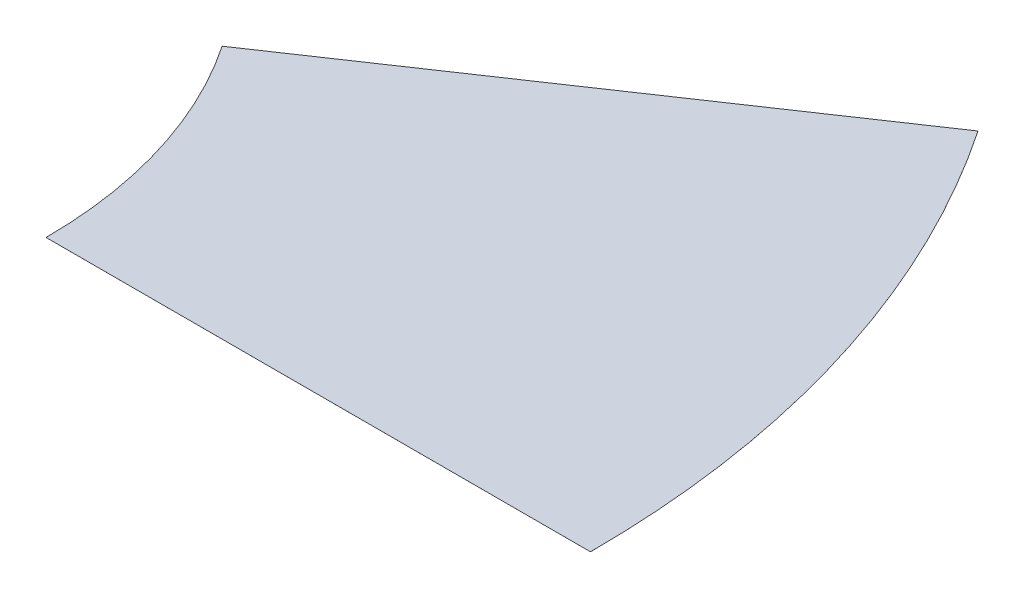
ISO-10303-21;
HEADER;
FILE_DESCRIPTION(('STEP AP214'),'2;1');
FILE_NAME('part.step','',(''),(''),'','','');
FILE_SCHEMA(('AUTOMOTIVE_DESIGN { 1 0 10303 214 1 1 1 1 }'));
ENDSEC;
DATA;
#1=APPLICATION_CONTEXT('core data for automotive mechanical design processes');
#2=APPLICATION_PROTOCOL_DEFINITION('international standard','automotive_design',2000,#1);
#3=PRODUCT_CONTEXT('',#1,'mechanical');
#4=PRODUCT('Part','Part','',(#3));
#5=PRODUCT_RELATED_PRODUCT_CATEGORY('part','',(#4));
#6=PRODUCT_DEFINITION_FORMATION('','',#4);
#7=PRODUCT_DEFINITION_CONTEXT('part definition',#1,'design');
#8=PRODUCT_DEFINITION('design','',#6,#7);
#9=PRODUCT_DEFINITION_SHAPE('','',#8);
#10=(LENGTH_UNIT() NAMED_UNIT(*) SI_UNIT(.MILLI.,.METRE.));
#11=(NAMED_UNIT(*) PLANE_ANGLE_UNIT() SI_UNIT($,.RADIAN.));
#12=(NAMED_UNIT(*) SI_UNIT($,.STERADIAN.) SOLID_ANGLE_UNIT());
#13=UNCERTAINTY_MEASURE_WITH_UNIT(LENGTH_MEASURE(1.E-05),#10,'distance_accuracy_value','');
#14=(GEOMETRIC_REPRESENTATION_CONTEXT(3) GLOBAL_UNCERTAINTY_ASSIGNED_CONTEXT((#13)) GLOBAL_UNIT_ASSIGNED_CONTEXT((#10,
#11,#12)) REPRESENTATION_CONTEXT('',''));
#15=CARTESIAN_POINT('',(0.,0.,0.));
#16=DIRECTION('',(0.,0.,1.));
#17=DIRECTION('',(1.,0.,0.));
#18=AXIS2_PLACEMENT_3D('',#15,#16,#17);
#19=CARTESIAN_POINT('',(0.,0.001,0.));
#20=DIRECTION('',(0.,-1.,0.));
#21=DIRECTION('',(0.,0.,-1.));
#22=AXIS2_PLACEMENT_3D('',#19,#20,#21);
#23=CYLINDRICAL_SURFACE('',#22,110.);
#24=CARTESIAN_POINT('',(0.,0.,0.));
#25=DIRECTION('',(0.,1.,0.));
#26=DIRECTION('',(0.,0.,1.));
#27=AXIS2_PLACEMENT_3D('',#24,#25,#26);
#28=CIRCLE('',#27,110.);
#29=CARTESIAN_POINT('',(110.,0.,0.));
#30=VERTEX_POINT('',#29);
#31=CARTESIAN_POINT('',(91.1941329810549,0.,-61.5112193817816));
#32=VERTEX_POINT('',#31);
#33=EDGE_CURVE('E97',#30,#32,#28,.T.);
#34=ORIENTED_EDGE('',*,*,#33,.T.);
#35=DIRECTION('',(0.,-1.,0.));
#36=VECTOR('',#35,1.);
#37=CARTESIAN_POINT('',(91.1941329810549,0.001,-61.5112193817816));
#38=LINE('',#37,#36);
#39=CARTESIAN_POINT('',(91.1941329810549,0.001,-61.5112193817816));
#40=VERTEX_POINT('',#39);
#41=EDGE_CURVE('E11',#40,#32,#38,.T.);
#42=ORIENTED_EDGE('',*,*,#41,.F.);
#43=CARTESIAN_POINT('',(0.,0.001,0.));
#44=DIRECTION('',(0.,1.,0.));
#45=DIRECTION('',(0.,0.,1.));
#46=AXIS2_PLACEMENT_3D('',#43,#44,#45);
#47=CIRCLE('',#46,110.);
#48=CARTESIAN_POINT('',(110.,0.001,0.));
#49=VERTEX_POINT('',#48);
#50=EDGE_CURVE('E83',#49,#40,#47,.T.);
#51=ORIENTED_EDGE('',*,*,#50,.F.);
#52=DIRECTION('',(0.,-1.,0.));
#53=VECTOR('',#52,1.);
#54=CARTESIAN_POINT('',(110.,0.001,0.));
#55=LINE('',#54,#53);
#56=EDGE_CURVE('E50',#49,#30,#55,.T.);
#57=ORIENTED_EDGE('',*,*,#56,.T.);
#58=EDGE_LOOP('',(#34,#42,#51,#57));
#59=FACE_BOUND('',#58,.T.);
#60=ADVANCED_FACE('F34',(#59),#23,.T.);
#61=CARTESIAN_POINT('',(91.1941329810549,0.001,-61.5112193817816));
#62=DIRECTION('',(0.559192903470742,0.,0.829037572555045));
#63=DIRECTION('',(0.829037572555045,0.,-0.559192903470742));
#64=AXIS2_PLACEMENT_3D('',#61,#62,#63);
#65=PLANE('',#64);
#66=DIRECTION('',(-0.829037572555045,0.,0.559192903470742));
#67=VECTOR('',#66,1.);
#68=CARTESIAN_POINT('',(91.1941329810549,0.,-61.5112193817816));
#69=LINE('',#68,#67);
#70=CARTESIAN_POINT('',(41.4518786277522,0.,-27.9596451735371));
#71=VERTEX_POINT('',#70);
#72=EDGE_CURVE('E88',#32,#71,#69,.T.);
#73=ORIENTED_EDGE('',*,*,#72,.T.);
#74=DIRECTION('',(0.,-1.,0.));
#75=VECTOR('',#74,1.);
#76=CARTESIAN_POINT('',(41.4518786277522,0.001,-27.9596451735371));
#77=LINE('',#76,#75);
#78=CARTESIAN_POINT('',(41.4518786277522,0.001,-27.9596451735371));
#79=VERTEX_POINT('',#78);
#80=EDGE_CURVE('E42',#79,#71,#77,.T.);
#81=ORIENTED_EDGE('',*,*,#80,.F.);
#82=DIRECTION('',(-0.829037572555045,0.,0.559192903470742));
#83=VECTOR('',#82,1.);
#84=CARTESIAN_POINT('',(91.1941329810549,0.001,-61.5112193817816));
#85=LINE('',#84,#83);
#86=EDGE_CURVE('E75',#40,#79,#85,.T.);
#87=ORIENTED_EDGE('',*,*,#86,.F.);
#88=ORIENTED_EDGE('',*,*,#41,.T.);
#89=EDGE_LOOP('',(#73,#81,#87,#88));
#90=FACE_BOUND('',#89,.T.);
#91=ADVANCED_FACE('F87',(#90),#65,.F.);
#92=CARTESIAN_POINT('',(0.,0.001,0.));
#93=DIRECTION('',(0.,-1.,0.));
#94=DIRECTION('',(0.,0.,-1.));
#95=AXIS2_PLACEMENT_3D('',#92,#93,#94);
#96=CYLINDRICAL_SURFACE('',#95,50.);
#97=CARTESIAN_POINT('',(0.,0.,0.));
#98=DIRECTION('',(0.,1.,0.));
#99=DIRECTION('',(0.,0.,1.));
#100=AXIS2_PLACEMENT_3D('',#97,#98,#99);
#101=CIRCLE('',#100,50.);
#102=CARTESIAN_POINT('',(50.,0.,0.));
#103=VERTEX_POINT('',#102);
#104=EDGE_CURVE('E100',#103,#71,#101,.T.);
#105=ORIENTED_EDGE('',*,*,#104,.F.);
#106=DIRECTION('',(0.,-1.,0.));
#107=VECTOR('',#106,1.);
#108=CARTESIAN_POINT('',(50.,0.001,0.));
#109=LINE('',#108,#107);
#110=CARTESIAN_POINT('',(50.,0.001,0.));
#111=VERTEX_POINT('',#110);
#112=EDGE_CURVE('E64',#111,#103,#109,.T.);
#113=ORIENTED_EDGE('',*,*,#112,.F.);
#114=CARTESIAN_POINT('',(0.,0.001,0.));
#115=DIRECTION('',(0.,1.,0.));
#116=DIRECTION('',(0.,0.,1.));
#117=AXIS2_PLACEMENT_3D('',#114,#115,#116);
#118=CIRCLE('',#117,50.);
#119=EDGE_CURVE('E82',#111,#79,#118,.T.);
#120=ORIENTED_EDGE('',*,*,#119,.T.);
#121=ORIENTED_EDGE('',*,*,#80,.T.);
#122=EDGE_LOOP('',(#105,#113,#120,#121));
#123=FACE_BOUND('',#122,.T.);
#124=ADVANCED_FACE('F91',(#123),#96,.F.);
#125=CARTESIAN_POINT('',(110.,0.001,0.));
#126=DIRECTION('',(0.,0.,1.));
#127=DIRECTION('',(1.,0.,0.));
#128=AXIS2_PLACEMENT_3D('',#125,#126,#127);
#129=PLANE('',#128);
#130=DIRECTION('',(-1.,0.,0.));
#131=VECTOR('',#130,1.);
#132=CARTESIAN_POINT('',(110.,0.,0.));
#133=LINE('',#132,#131);
#134=EDGE_CURVE('E102',#30,#103,#133,.T.);
#135=ORIENTED_EDGE('',*,*,#134,.F.);
#136=ORIENTED_EDGE('',*,*,#56,.F.);
#137=DIRECTION('',(-1.,0.,0.));
#138=VECTOR('',#137,1.);
#139=CARTESIAN_POINT('',(110.,0.001,0.));
#140=LINE('',#139,#138);
#141=EDGE_CURVE('E92',#49,#111,#140,.T.);
#142=ORIENTED_EDGE('',*,*,#141,.T.);
#143=ORIENTED_EDGE('',*,*,#112,.T.);
#144=EDGE_LOOP('',(#135,#136,#142,#143));
#145=FACE_BOUND('',#144,.T.);
#146=ADVANCED_FACE('F108',(#145),#129,.T.);
#147=CARTESIAN_POINT('',(0.,0.001,0.));
#148=DIRECTION('',(0.,1.,0.));
#149=DIRECTION('',(0.,0.,1.));
#150=AXIS2_PLACEMENT_3D('',#147,#148,#149);
#151=PLANE('',#150);
#152=ORIENTED_EDGE('',*,*,#50,.T.);
#153=ORIENTED_EDGE('',*,*,#86,.T.);
#154=ORIENTED_EDGE('',*,*,#119,.F.);
#155=ORIENTED_EDGE('',*,*,#141,.F.);
#156=EDGE_LOOP('',(#152,#153,#154,#155));
#157=FACE_BOUND('',#156,.T.);
#158=ADVANCED_FACE('F79',(#157),#151,.T.);
#159=CARTESIAN_POINT('',(0.,0.,0.));
#160=DIRECTION('',(0.,1.,0.));
#161=DIRECTION('',(0.,0.,1.));
#162=AXIS2_PLACEMENT_3D('',#159,#160,#161);
#163=PLANE('',#162);
#164=ORIENTED_EDGE('',*,*,#33,.F.);
#165=ORIENTED_EDGE('',*,*,#134,.T.);
#166=ORIENTED_EDGE('',*,*,#104,.T.);
#167=ORIENTED_EDGE('',*,*,#72,.F.);
#168=EDGE_LOOP('',(#164,#165,#166,#167));
#169=FACE_BOUND('',#168,.T.);
#170=ADVANCED_FACE('F107',(#169),#163,.F.);
#171=CLOSED_SHELL('',(#60,#91,#124,#146,#158,#170));
#172=MANIFOLD_SOLID_BREP('B2',#171);
#173=ADVANCED_BREP_SHAPE_REPRESENTATION('',(#18,#172),#14);
#174=SHAPE_DEFINITION_REPRESENTATION(#9,#173);
ENDSEC;
END-ISO-10303-21;
